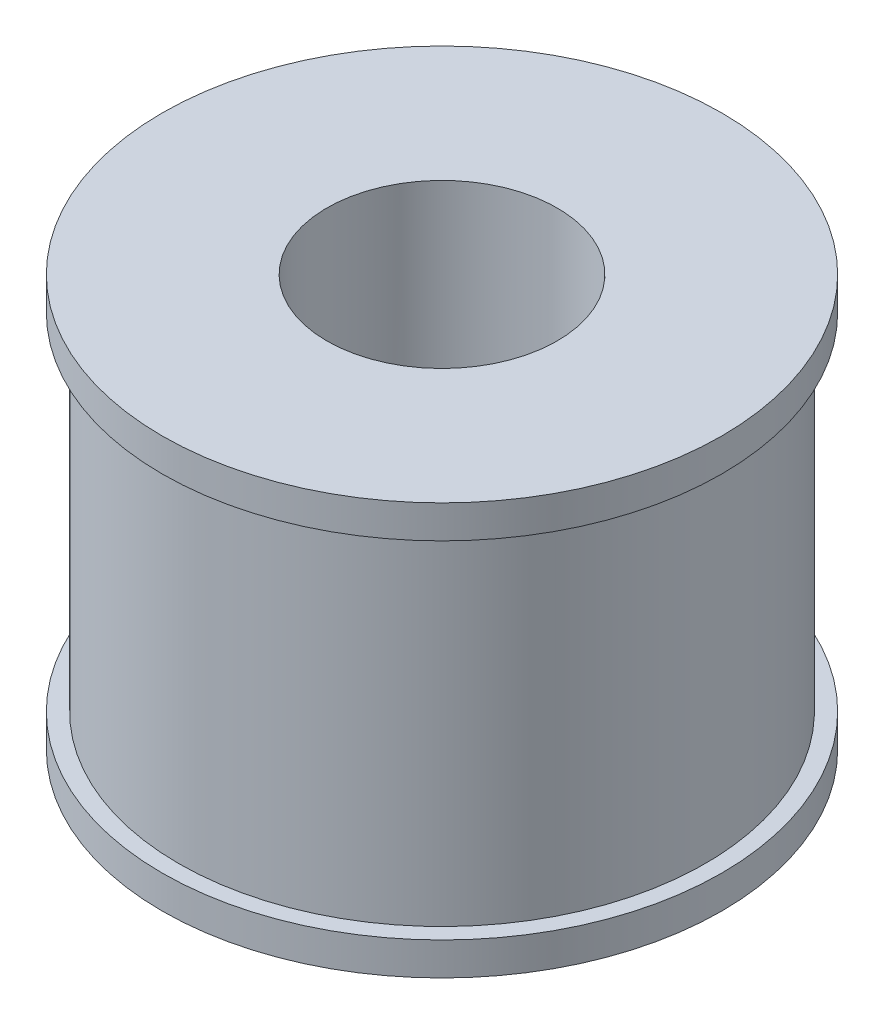
ISO-10303-21;
HEADER;
FILE_DESCRIPTION(('STEP AP214'),'2;1');
FILE_NAME('part.step','',(''),(''),'','','');
FILE_SCHEMA(('AUTOMOTIVE_DESIGN { 1 0 10303 214 1 1 1 1 }'));
ENDSEC;
DATA;
#1=APPLICATION_CONTEXT('core data for automotive mechanical design processes');
#2=APPLICATION_PROTOCOL_DEFINITION('international standard','automotive_design',2000,#1);
#3=PRODUCT_CONTEXT('',#1,'mechanical');
#4=PRODUCT('Part','Part','',(#3));
#5=PRODUCT_RELATED_PRODUCT_CATEGORY('part','',(#4));
#6=PRODUCT_DEFINITION_FORMATION('','',#4);
#7=PRODUCT_DEFINITION_CONTEXT('part definition',#1,'design');
#8=PRODUCT_DEFINITION('design','',#6,#7);
#9=PRODUCT_DEFINITION_SHAPE('','',#8);
#10=(LENGTH_UNIT() NAMED_UNIT(*) SI_UNIT(.MILLI.,.METRE.));
#11=(NAMED_UNIT(*) PLANE_ANGLE_UNIT() SI_UNIT($,.RADIAN.));
#12=(NAMED_UNIT(*) SI_UNIT($,.STERADIAN.) SOLID_ANGLE_UNIT());
#13=UNCERTAINTY_MEASURE_WITH_UNIT(LENGTH_MEASURE(1.E-05),#10,'distance_accuracy_value','');
#14=(GEOMETRIC_REPRESENTATION_CONTEXT(3) GLOBAL_UNCERTAINTY_ASSIGNED_CONTEXT((#13)) GLOBAL_UNIT_ASSIGNED_CONTEXT((#10,
#11,#12)) REPRESENTATION_CONTEXT('',''));
#15=CARTESIAN_POINT('',(0.,0.,0.));
#16=DIRECTION('',(0.,0.,1.));
#17=DIRECTION('',(1.,0.,0.));
#18=AXIS2_PLACEMENT_3D('',#15,#16,#17);
#19=CARTESIAN_POINT('',(0.,2.,0.));
#20=DIRECTION('',(0.,-1.,0.));
#21=DIRECTION('',(0.,0.,-1.));
#22=AXIS2_PLACEMENT_3D('',#19,#20,#21);
#23=PLANE('',#22);
#24=CARTESIAN_POINT('',(0.,2.,0.));
#25=DIRECTION('',(0.,-1.,0.));
#26=DIRECTION('',(0.,0.,-1.));
#27=AXIS2_PLACEMENT_3D('',#24,#25,#26);
#28=CIRCLE('',#27,16.);
#29=CARTESIAN_POINT('',(0.,2.,-16.));
#30=VERTEX_POINT('',#29);
#31=EDGE_CURVE('E11',#30,#30,#28,.F.);
#32=ORIENTED_EDGE('',*,*,#31,.F.);
#33=EDGE_LOOP('',(#32));
#34=FACE_BOUND('',#33,.T.);
#35=CARTESIAN_POINT('',(0.,2.,0.));
#36=DIRECTION('',(0.,1.,0.));
#37=DIRECTION('',(0.,0.,1.));
#38=AXIS2_PLACEMENT_3D('',#35,#36,#37);
#39=CIRCLE('',#38,17.);
#40=CARTESIAN_POINT('',(0.,2.,17.));
#41=VERTEX_POINT('',#40);
#42=EDGE_CURVE('E157',#41,#41,#39,.T.);
#43=ORIENTED_EDGE('',*,*,#42,.T.);
#44=EDGE_LOOP('',(#43));
#45=FACE_BOUND('',#44,.T.);
#46=ADVANCED_FACE('F37',(#34,#45),#23,.F.);
#47=CARTESIAN_POINT('',(0.,23.,0.));
#48=DIRECTION('',(0.,1.,0.));
#49=DIRECTION('',(0.,0.,1.));
#50=AXIS2_PLACEMENT_3D('',#47,#48,#49);
#51=PLANE('',#50);
#52=CARTESIAN_POINT('',(0.,23.,0.));
#53=DIRECTION('',(0.,1.,0.));
#54=DIRECTION('',(0.,0.,1.));
#55=AXIS2_PLACEMENT_3D('',#52,#53,#54);
#56=CIRCLE('',#55,16.);
#57=CARTESIAN_POINT('',(0.,23.,16.));
#58=VERTEX_POINT('',#57);
#59=EDGE_CURVE('E46',#58,#58,#56,.F.);
#60=ORIENTED_EDGE('',*,*,#59,.F.);
#61=EDGE_LOOP('',(#60));
#62=FACE_BOUND('',#61,.T.);
#63=CARTESIAN_POINT('',(0.,23.,0.));
#64=DIRECTION('',(0.,-1.,0.));
#65=DIRECTION('',(0.,0.,-1.));
#66=AXIS2_PLACEMENT_3D('',#63,#64,#65);
#67=CIRCLE('',#66,17.);
#68=CARTESIAN_POINT('',(0.,23.,-17.));
#69=VERTEX_POINT('',#68);
#70=EDGE_CURVE('E151',#69,#69,#67,.T.);
#71=ORIENTED_EDGE('',*,*,#70,.T.);
#72=EDGE_LOOP('',(#71));
#73=FACE_BOUND('',#72,.T.);
#74=ADVANCED_FACE('F144',(#62,#73),#51,.F.);
#75=CARTESIAN_POINT('',(0.,5.,-16.501));
#76=DIRECTION('',(0.,0.,1.));
#77=DIRECTION('',(1.,0.,0.));
#78=AXIS2_PLACEMENT_3D('',#75,#76,#77);
#79=CYLINDRICAL_SURFACE('',#78,1.625);
#80=CARTESIAN_POINT('',(0.,5.,-7.5));
#81=DIRECTION('',(0.,0.,-1.));
#82=DIRECTION('',(-1.,0.,0.));
#83=AXIS2_PLACEMENT_3D('',#80,#81,#82);
#84=CIRCLE('',#83,1.625);
#85=CARTESIAN_POINT('',(-1.625,5.,-7.5));
#86=VERTEX_POINT('',#85);
#87=EDGE_CURVE('E129',#86,#86,#84,.F.);
#88=ORIENTED_EDGE('',*,*,#87,.T.);
#89=EDGE_LOOP('',(#88));
#90=FACE_BOUND('',#89,.T.);
#91=CARTESIAN_POINT('',(1.625,5.,-15.9172665681014));
#92=CARTESIAN_POINT('',(1.62499606078793,5.0910240593403,-15.9172676510475));
#93=CARTESIAN_POINT('',(1.61732619683328,5.18210811964596,-15.9180557754324));
#94=CARTESIAN_POINT('',(1.58684576724402,5.36175036702601,-15.9211226386814));
#95=CARTESIAN_POINT('',(1.5640185643267,5.45030566690781,-15.9234030154599));
#96=CARTESIAN_POINT('',(1.5038954878935,5.62226292071555,-15.929193477992));
#97=CARTESIAN_POINT('',(1.4666084446112,5.70566798378692,-15.9327028131274));
#98=CARTESIAN_POINT('',(1.37864120392538,5.8650179928389,-15.9405548559947));
#99=CARTESIAN_POINT('',(1.32796364568506,5.94096440481843,-15.9448973994617));
#100=CARTESIAN_POINT('',(1.21444999951955,6.08354367004625,-15.9539447868819));
#101=CARTESIAN_POINT('',(1.15157395936691,6.15014464514957,-15.958650789883));
#102=CARTESIAN_POINT('',(1.0155335814702,6.27186792841075,-15.9678843323712));
#103=CARTESIAN_POINT('',(0.942368771016045,6.32698970887652,-15.9724118636463));
#104=CARTESIAN_POINT('',(0.787632151942316,6.42430032376049,-15.9807898037101));
#105=CARTESIAN_POINT('',(0.706042490217867,6.46646090829568,-15.9846387257468));
#106=CARTESIAN_POINT('',(0.536896093852683,6.53647160447494,-15.9912131577967));
#107=CARTESIAN_POINT('',(0.449339508963147,6.56432207510864,-15.9939386959912));
#108=CARTESIAN_POINT('',(0.271066991967132,6.60482837485337,-15.9979511293628));
#109=CARTESIAN_POINT('',(0.180363077462553,6.61753659564644,-15.9992429839665));
#110=CARTESIAN_POINT('',(-0.00189875307088815,6.62755977964678,-16.0002593634928));
#111=CARTESIAN_POINT('',(-0.0934566462484766,6.62487515357203,-15.9999839302344));
#112=CARTESIAN_POINT('',(-0.274471735654066,6.60423135068846,-15.9979008247753));
#113=CARTESIAN_POINT('',(-0.363935431020959,6.5863285115981,-15.9960988040744));
#114=CARTESIAN_POINT('',(-0.538581699806607,6.53584426206,-15.9911715206921));
#115=CARTESIAN_POINT('',(-0.6237642160999,6.50326265580545,-15.9880462403591));
#116=CARTESIAN_POINT('',(-0.787607511537278,6.42428407724619,-15.9808140755214));
#117=CARTESIAN_POINT('',(-0.866256207110845,6.377862205549,-15.976705424529));
#118=CARTESIAN_POINT('',(-1.01466746174738,6.27253892483887,-15.9679674671444));
#119=CARTESIAN_POINT('',(-1.08442975182622,6.21363713821293,-15.9633381449999));
#120=CARTESIAN_POINT('',(-1.21341793414155,6.08470926256256,-15.9540536059509));
#121=CARTESIAN_POINT('',(-1.27259484492326,6.01463415989806,-15.9493983664835));
#122=CARTESIAN_POINT('',(-1.37835315834778,5.86551867536658,-15.9406075082658));
#123=CARTESIAN_POINT('',(-1.42493454176331,5.78647827981421,-15.9364718903087));
#124=CARTESIAN_POINT('',(-1.50417945927507,5.62163789762751,-15.9291881714658));
#125=CARTESIAN_POINT('',(-1.53683991715189,5.53583642190079,-15.9260402888884));
#126=CARTESIAN_POINT('',(-1.58727684911276,5.35992829652819,-15.921092932866));
#127=CARTESIAN_POINT('',(-1.60505379124498,5.26982178235886,-15.9192934170187));
#128=CARTESIAN_POINT('',(-1.62515595811183,5.08829152393263,-15.9172538982886));
#129=CARTESIAN_POINT('',(-1.62754973066459,4.99687544504994,-15.9170069771084));
#130=CARTESIAN_POINT('',(-1.61699767660353,4.81494346664697,-15.9180823448585));
#131=CARTESIAN_POINT('',(-1.60405206390762,4.72442755459102,-15.9194046119055));
#132=CARTESIAN_POINT('',(-1.56324608904987,4.54706544643436,-15.9234630735524));
#133=CARTESIAN_POINT('',(-1.53541818271954,4.46021170674371,-15.926196190871));
#134=CARTESIAN_POINT('',(-1.46567070273802,4.29240483112173,-15.9327659000671));
#135=CARTESIAN_POINT('',(-1.42375079645537,4.21145183452805,-15.9366025179915));
#136=CARTESIAN_POINT('',(-1.32683772903147,4.05743209040902,-15.9449636720481));
#137=CARTESIAN_POINT('',(-1.27179917061536,3.98439403857098,-15.9494905768819));
#138=CARTESIAN_POINT('',(-1.15027615950833,3.84856856091503,-15.9587144979968));
#139=CARTESIAN_POINT('',(-1.08379141444292,3.78578139701945,-15.9634115186209));
#140=CARTESIAN_POINT('',(-0.94096579590208,3.67200335816707,-15.9724673363053));
#141=CARTESIAN_POINT('',(-0.864589189243281,3.6210572191203,-15.9768248106361));
#142=CARTESIAN_POINT('',(-0.704324245717182,3.53271534203882,-15.9846912772566));
#143=CARTESIAN_POINT('',(-0.620436014608218,3.49531941326419,-15.9882002814897));
#144=CARTESIAN_POINT('',(-0.447684839878385,3.43521518223265,-15.9939684674969));
#145=CARTESIAN_POINT('',(-0.358831354012277,3.41247992552822,-15.9962299418098));
#146=CARTESIAN_POINT('',(-0.178544036244694,3.38225445521685,-15.9992576727053));
#147=CARTESIAN_POINT('',(-0.0871102793865123,3.37476379870602,-16.0000239727274));
#148=CARTESIAN_POINT('',(0.0953028453720753,3.37524650162272,-15.9999749810733));
#149=CARTESIAN_POINT('',(0.186282406842767,3.38315043943933,-15.999166789531));
#150=CARTESIAN_POINT('',(0.365614133819023,3.41405231308992,-15.9960736410199));
#151=CARTESIAN_POINT('',(0.453966297442373,3.43705025973667,-15.9937886829933));
#152=CARTESIAN_POINT('',(0.625534210140409,3.49746794221035,-15.9879979877415));
#153=CARTESIAN_POINT('',(0.708750707030929,3.53488557257953,-15.9844924287469));
#154=CARTESIAN_POINT('',(0.86773305269915,3.62307309146041,-15.9766511515298));
#155=CARTESIAN_POINT('',(0.943498937515086,3.67384291538386,-15.9723154373231));
#156=CARTESIAN_POINT('',(1.08578506651673,3.78755380963585,-15.9632760963413));
#157=CARTESIAN_POINT('',(1.15226390085327,3.85054657709161,-15.9585709592728));
#158=CARTESIAN_POINT('',(1.2737381079708,3.98681284872344,-15.9493358078429));
#159=CARTESIAN_POINT('',(1.32873072347144,4.06008881435167,-15.9448058357422));
#160=CARTESIAN_POINT('',(1.42578561431275,4.21505182380254,-15.9364212391675));
#161=CARTESIAN_POINT('',(1.46781371105772,4.29676035526403,-15.93256841116));
#162=CARTESIAN_POINT('',(1.53749692271342,4.46606220178281,-15.9259957127517));
#163=CARTESIAN_POINT('',(1.56516821714008,4.55364876622409,-15.9232745676811));
#164=CARTESIAN_POINT('',(1.59846730348592,4.70144081145875,-15.9199581471362));
#165=CARTESIAN_POINT('',(1.60840342749754,4.76070208040587,-15.918953592283));
#166=CARTESIAN_POINT('',(1.62167106027529,4.87996686967012,-15.9176074471159));
#167=CARTESIAN_POINT('',(1.62500259787774,4.93997038674535,-15.9172658539075));
#168=CARTESIAN_POINT('',(1.625,5.,-15.9172665681014));
#169=B_SPLINE_CURVE_WITH_KNOTS('',3,(#91,#92,#93,#94,#95,#96,#97,#98,#99,#100,#101,#102,#103,
#104,#105,#106,#107,#108,#109,#110,#111,#112,#113,#114,#115,#116,#117,#118,#119,#120,#121,#122,
#123,#124,#125,#126,#127,#128,#129,#130,#131,#132,#133,#134,#135,#136,#137,#138,#139,#140,#141,
#142,#143,#144,#145,#146,#147,#148,#149,#150,#151,#152,#153,#154,#155,#156,#157,#158,#159,#160,
#161,#162,#163,#164,#165,#166,#167,#168),.UNSPECIFIED.,.T.,.F.,(4,2,2,2,2,2,2,2,2,2,2,2,2,2,2,2,
2,2,2,2,2,2,2,2,2,2,2,2,2,2,2,2,2,2,2,2,2,2,4),(0.,0.272852956061154,0.546005902280196,
0.818992303389229,1.09192494114653,1.36576705141177,1.63962174726702,1.91406916569291,
2.18850969887747,2.46199789376216,2.73547879136132,3.00795165179119,3.28042814696918,
3.55339783097986,3.82637577559391,4.1005859100087,4.37479646300728,4.64906757915218,
4.92333006985417,5.19636958710352,5.46940529668031,5.74184797408863,6.01429708276089,
6.28770305508802,6.56111601216877,6.83554572748433,7.10997157963178,7.38389143534204,
7.65780333269974,7.93048288937264,8.20316264138286,8.47580259374747,8.74844122730147,
9.02225916627795,9.29614276022058,9.57074234642815,9.84503179449827,10.0249768448564,
10.2049211095536),.UNSPECIFIED.);
#170=CARTESIAN_POINT('',(1.625,5.,-15.9172665681014));
#171=VERTEX_POINT('',#170);
#172=EDGE_CURVE('E230',#171,#171,#169,.T.);
#173=ORIENTED_EDGE('',*,*,#172,.F.);
#174=EDGE_LOOP('',(#173));
#175=FACE_BOUND('',#174,.T.);
#176=ADVANCED_FACE('F147',(#90,#175),#79,.F.);
#177=CARTESIAN_POINT('',(0.,25.,0.));
#178=DIRECTION('',(0.,1.,0.));
#179=DIRECTION('',(0.,0.,1.));
#180=AXIS2_PLACEMENT_3D('',#177,#178,#179);
#181=PLANE('',#180);
#182=CARTESIAN_POINT('',(0.,25.,0.));
#183=DIRECTION('',(0.,-1.,0.));
#184=DIRECTION('',(0.,0.,-1.));
#185=AXIS2_PLACEMENT_3D('',#182,#183,#184);
#186=CIRCLE('',#185,17.);
#187=CARTESIAN_POINT('',(0.,25.,-17.));
#188=VERTEX_POINT('',#187);
#189=EDGE_CURVE('E153',#188,#188,#186,.T.);
#190=ORIENTED_EDGE('',*,*,#189,.F.);
#191=EDGE_LOOP('',(#190));
#192=FACE_BOUND('',#191,.T.);
#193=CARTESIAN_POINT('',(0.,25.,0.));
#194=DIRECTION('',(0.,1.,0.));
#195=DIRECTION('',(0.,0.,1.));
#196=AXIS2_PLACEMENT_3D('',#193,#194,#195);
#197=CIRCLE('',#196,7.);
#198=CARTESIAN_POINT('',(0.,25.,7.));
#199=VERTEX_POINT('',#198);
#200=EDGE_CURVE('E133',#199,#199,#197,.T.);
#201=ORIENTED_EDGE('',*,*,#200,.F.);
#202=EDGE_LOOP('',(#201));
#203=FACE_BOUND('',#202,.T.);
#204=ADVANCED_FACE('F179',(#192,#203),#181,.T.);
#205=CARTESIAN_POINT('',(0.,0.,0.));
#206=DIRECTION('',(0.,1.,0.));
#207=DIRECTION('',(0.,0.,1.));
#208=AXIS2_PLACEMENT_3D('',#205,#206,#207);
#209=PLANE('',#208);
#210=CARTESIAN_POINT('',(0.,0.,0.));
#211=DIRECTION('',(0.,-1.,0.));
#212=DIRECTION('',(0.,0.,-1.));
#213=AXIS2_PLACEMENT_3D('',#210,#211,#212);
#214=CIRCLE('',#213,3.1);
#215=CARTESIAN_POINT('',(0.,0.,-3.1));
#216=VERTEX_POINT('',#215);
#217=EDGE_CURVE('E208',#216,#216,#214,.T.);
#218=ORIENTED_EDGE('',*,*,#217,.F.);
#219=EDGE_LOOP('',(#218));
#220=FACE_BOUND('',#219,.T.);
#221=CARTESIAN_POINT('',(0.,0.,0.));
#222=DIRECTION('',(0.,1.,0.));
#223=DIRECTION('',(0.,0.,1.));
#224=AXIS2_PLACEMENT_3D('',#221,#222,#223);
#225=CIRCLE('',#224,17.);
#226=CARTESIAN_POINT('',(0.,0.,17.));
#227=VERTEX_POINT('',#226);
#228=EDGE_CURVE('E117',#227,#227,#225,.T.);
#229=ORIENTED_EDGE('',*,*,#228,.F.);
#230=EDGE_LOOP('',(#229));
#231=FACE_BOUND('',#230,.T.);
#232=DIRECTION('',(-1.,0.,0.));
#233=VECTOR('',#232,1.);
#234=CARTESIAN_POINT('',(0.,0.,-4.5));
#235=LINE('',#234,#233);
#236=CARTESIAN_POINT('',(3.17,0.,-4.5));
#237=VERTEX_POINT('',#236);
#238=CARTESIAN_POINT('',(-3.17,0.,-4.5));
#239=VERTEX_POINT('',#238);
#240=EDGE_CURVE('E114',#237,#239,#235,.T.);
#241=ORIENTED_EDGE('',*,*,#240,.F.);
#242=DIRECTION('',(0.,0.,1.));
#243=VECTOR('',#242,1.);
#244=CARTESIAN_POINT('',(3.17,0.,-7.5));
#245=LINE('',#244,#243);
#246=CARTESIAN_POINT('',(3.17,0.,-7.5));
#247=VERTEX_POINT('',#246);
#248=EDGE_CURVE('E53',#247,#237,#245,.T.);
#249=ORIENTED_EDGE('',*,*,#248,.F.);
#250=DIRECTION('',(1.,0.,0.));
#251=VECTOR('',#250,1.);
#252=CARTESIAN_POINT('',(-3.17,0.,-7.5));
#253=LINE('',#252,#251);
#254=CARTESIAN_POINT('',(-3.17,0.,-7.5));
#255=VERTEX_POINT('',#254);
#256=EDGE_CURVE('E119',#255,#247,#253,.T.);
#257=ORIENTED_EDGE('',*,*,#256,.F.);
#258=DIRECTION('',(0.,0.,-1.));
#259=VECTOR('',#258,1.);
#260=CARTESIAN_POINT('',(-3.17,0.,-4.5));
#261=LINE('',#260,#259);
#262=EDGE_CURVE('E100',#239,#255,#261,.T.);
#263=ORIENTED_EDGE('',*,*,#262,.F.);
#264=EDGE_LOOP('',(#241,#249,#257,#263));
#265=FACE_BOUND('',#264,.T.);
#266=ADVANCED_FACE('F39',(#220,#231,#265),#209,.F.);
#267=CARTESIAN_POINT('',(1.625,5.,-2.63995738601971));
#268=CARTESIAN_POINT('',(1.62499369358639,5.08402011840656,-2.63996569197711));
#269=CARTESIAN_POINT('',(1.61843926848346,5.16813134161948,-2.6440306646884));
#270=CARTESIAN_POINT('',(1.59258026030076,5.33371892131321,-2.65968063273482));
#271=CARTESIAN_POINT('',(1.57325150158178,5.41518997394179,-2.67127988610549));
#272=CARTESIAN_POINT('',(1.5229416019621,5.57278191734646,-2.70027374321845));
#273=CARTESIAN_POINT('',(1.49202732847947,5.64893059031451,-2.71763502604676));
#274=CARTESIAN_POINT('',(1.41962906763283,5.79493818250812,-2.75614401860979));
#275=CARTESIAN_POINT('',(1.37814366245454,5.86479625632785,-2.77729223614005));
#276=CARTESIAN_POINT('',(1.28135217783335,6.00326047831771,-2.82334190963701));
#277=CARTESIAN_POINT('',(1.2251308753348,6.07117179097527,-2.84840976473617));
#278=CARTESIAN_POINT('',(1.1023605526905,6.19714998002737,-2.89813560243633));
#279=CARTESIAN_POINT('',(1.03580595908106,6.25521150817134,-2.92279335584776));
#280=CARTESIAN_POINT('',(0.888094358984732,6.36416848437918,-2.97115595461785));
#281=CARTESIAN_POINT('',(0.806212382161948,6.41418534814089,-2.99464636761452));
#282=CARTESIAN_POINT('',(0.633732733383832,6.49941347272161,-3.03582277624352));
#283=CARTESIAN_POINT('',(0.543141151865711,6.5346349883903,-3.05351279033609));
#284=CARTESIAN_POINT('',(0.363195332507896,6.58644020349888,-3.07988813626475));
#285=CARTESIAN_POINT('',(0.274282091522951,6.60424930744631,-3.08916152676322));
#286=CARTESIAN_POINT('',(0.0942858955441184,6.62478424111477,-3.09987375068868));
#287=CARTESIAN_POINT('',(0.00320444788753966,6.62752025885552,-3.10131787596824));
#288=CARTESIAN_POINT('',(-0.169226436953113,6.61824761682093,-3.09646459293852));
#289=CARTESIAN_POINT('',(-0.250675696619699,6.60762007394134,-3.0908922559455));
#290=CARTESIAN_POINT('',(-0.410437049802163,6.57442799872566,-3.07375939172626));
#291=CARTESIAN_POINT('',(-0.488748905643017,6.55186256386326,-3.06219841174913));
#292=CARTESIAN_POINT('',(-0.641286454469586,6.49535276203171,-3.03394965052952));
#293=CARTESIAN_POINT('',(-0.715448366106232,6.46126884766187,-3.01719921644795));
#294=CARTESIAN_POINT('',(-0.857164912791588,6.38291600562167,-2.98004077213943));
#295=CARTESIAN_POINT('',(-0.924717270339831,6.33864358471748,-2.95963150797671));
#296=CARTESIAN_POINT('',(-1.05859628134866,6.23604734259653,-2.91459297851262));
#297=CARTESIAN_POINT('',(-1.12410789232571,6.1767552175741,-2.88974567439597));
#298=CARTESIAN_POINT('',(-1.24471946946172,6.04836431736453,-2.83988406527652));
#299=CARTESIAN_POINT('',(-1.29981005622849,5.97925680489467,-2.81486963061241));
#300=CARTESIAN_POINT('',(-1.40208881995267,5.82692302196492,-2.76543137638124));
#301=CARTESIAN_POINT('',(-1.44837848646489,5.74302752082937,-2.74119147050608));
#302=CARTESIAN_POINT('',(-1.52585070400779,5.56711017175289,-2.6988416802505));
#303=CARTESIAN_POINT('',(-1.55705009111533,5.47509751624713,-2.68072497111122));
#304=CARTESIAN_POINT('',(-1.60081241171286,5.29332130295122,-2.65480754447564));
#305=CARTESIAN_POINT('',(-1.61467922848063,5.20397835970499,-2.64629062268326));
#306=CARTESIAN_POINT('',(-1.62732459238139,5.02386205794669,-2.63853777607081));
#307=CARTESIAN_POINT('',(-1.62611652898328,4.93309004030733,-2.63929361519884));
#308=CARTESIAN_POINT('',(-1.60984275618565,4.76493085697804,-2.64923876494547));
#309=CARTESIAN_POINT('',(-1.59654159310065,4.68729783013928,-2.65735388246111));
#310=CARTESIAN_POINT('',(-1.5591717923286,4.5355451516447,-2.67944975176477));
#311=CARTESIAN_POINT('',(-1.53509916674596,4.46142681247462,-2.69343267585902));
#312=CARTESIAN_POINT('',(-1.47576398643234,4.31496554086245,-2.72641092538126));
#313=CARTESIAN_POINT('',(-1.44004557124197,4.24285358554413,-2.74560393467464));
#314=CARTESIAN_POINT('',(-1.35881804841414,4.10521952579725,-2.78669779590758));
#315=CARTESIAN_POINT('',(-1.31330391835398,4.0397008272235,-2.80860003445415));
#316=CARTESIAN_POINT('',(-1.20628480346784,3.90742364010256,-2.85635634305187));
#317=CARTESIAN_POINT('',(-1.14342934079155,3.84179639251155,-2.88233173401643));
#318=CARTESIAN_POINT('',(-1.00728117427384,3.72161905489838,-2.93268712127722));
#319=CARTESIAN_POINT('',(-0.933983800437785,3.66707394782967,-2.95706639657449));
#320=CARTESIAN_POINT('',(-0.775446273445874,3.56880599193446,-3.00261959020605));
#321=CARTESIAN_POINT('',(-0.689864375096574,3.52555870974024,-3.02364137636473));
#322=CARTESIAN_POINT('',(-0.51122177332194,3.45452537990951,-3.05890678382001));
#323=CARTESIAN_POINT('',(-0.418168346171317,3.426724493633,-3.07315690842782));
#324=CARTESIAN_POINT('',(-0.236965457939999,3.38997725980696,-3.09213987002578));
#325=CARTESIAN_POINT('',(-0.149216633307814,3.37946280092398,-3.0976622056168));
#326=CARTESIAN_POINT('',(0.0269588914443473,3.37283754354231,-3.10113227843175));
#327=CARTESIAN_POINT('',(0.11538528615591,3.37672059743097,-3.09908324856411));
#328=CARTESIAN_POINT('',(0.283219694811608,3.3978092080424,-3.08809352832672));
#329=CARTESIAN_POINT('',(0.362798824635575,3.41396888962501,-3.07969410154116));
#330=CARTESIAN_POINT('',(0.517955172786841,3.45764935668563,-3.05742838356155));
#331=CARTESIAN_POINT('',(0.593531865779954,3.48517162939514,-3.04356137673531));
#332=CARTESIAN_POINT('',(0.74191277498795,3.55187414423842,-3.01090776140316));
#333=CARTESIAN_POINT('',(0.814490807361442,3.59147057909153,-2.99194901124051));
#334=CARTESIAN_POINT('',(0.952248083460892,3.6806852724956,-2.95099922179534));
#335=CARTESIAN_POINT('',(1.01742403461112,3.73030796383891,-2.92900684265908));
#336=CARTESIAN_POINT('',(1.14594183471771,3.8443209118488,-2.88131987486187));
#337=CARTESIAN_POINT('',(1.20833253836179,3.90972543365618,-2.8554814992914));
#338=CARTESIAN_POINT('',(1.32166541281029,4.05027202334204,-2.80482859684973));
#339=CARTESIAN_POINT('',(1.37259565608734,4.12542410902335,-2.78001515840719));
#340=CARTESIAN_POINT('',(1.46375646526482,4.28787322455436,-2.73316111003119));
#341=CARTESIAN_POINT('',(1.50336480023787,4.37557728224365,-2.71130789266397));
#342=CARTESIAN_POINT('',(1.56665179853564,4.55788698365071,-2.6752492515408));
#343=CARTESIAN_POINT('',(1.59038304584357,4.65246868334933,-2.66101861378825));
#344=CARTESIAN_POINT('',(1.61194761392507,4.79018946005844,-2.64795592099182));
#345=CARTESIAN_POINT('',(1.61683277533652,4.83193618038413,-2.6449699904358));
#346=CARTESIAN_POINT('',(1.62336063808953,4.91578095549929,-2.64096858692304));
#347=CARTESIAN_POINT('',(1.62500316153163,4.9578790294377,-2.63995322207666));
#348=CARTESIAN_POINT('',(1.625,5.,-2.63995738601971));
#349=B_SPLINE_CURVE_WITH_KNOTS('',3,(#267,#268,#269,#270,#271,#272,#273,#274,#275,#276,#277,
#278,#279,#280,#281,#282,#283,#284,#285,#286,#287,#288,#289,#290,#291,#292,#293,#294,#295,#296,
#297,#298,#299,#300,#301,#302,#303,#304,#305,#306,#307,#308,#309,#310,#311,#312,#313,#314,#315,
#316,#317,#318,#319,#320,#321,#322,#323,#324,#325,#326,#327,#328,#329,#330,#331,#332,#333,#334,
#335,#336,#337,#338,#339,#340,#341,#342,#343,#344,#345,#346,#347,#348),.UNSPECIFIED.,.T.,.F.,(4,
2,2,2,2,2,2,2,2,2,2,2,2,2,2,2,2,2,2,2,2,2,2,2,2,2,2,2,2,2,2,2,2,2,2,2,2,2,2,2,4),(0.,
0.251882549586685,0.504243161386659,0.755169125749292,1.0061287623666,1.27996909428787,
1.55395764379918,1.84874530853398,2.14332831358926,2.41524801944688,2.68698391002695,
2.9328081263225,3.17865093003143,3.42758578948175,3.67660612629282,3.95081340792788,
4.22526632628097,4.52023431483547,4.81487244699452,5.08566593545422,5.3562189229825,
5.592695536212,5.8292597722065,6.07649721605832,6.32386172584941,6.60615445088863,
6.88857382597078,7.18145166593953,7.47404766305176,7.73824446561781,8.00232847144208,
8.24613454929827,8.48997254866696,8.74340731322427,8.99695437210027,9.27777037288049,
9.55887729621583,9.85332023949389,10.1467831127377,10.2730499597624,10.3993237339192),.UNSPECIFIED.);
#350=CARTESIAN_POINT('',(1.625,5.,-2.63995738601971));
#351=VERTEX_POINT('',#350);
#352=EDGE_CURVE('E154',#351,#351,#349,.T.);
#353=ORIENTED_EDGE('',*,*,#352,.T.);
#354=EDGE_LOOP('',(#353));
#355=FACE_BOUND('',#354,.T.);
#356=CARTESIAN_POINT('',(0.,5.,-4.5));
#357=DIRECTION('',(0.,0.,1.));
#358=DIRECTION('',(1.,0.,0.));
#359=AXIS2_PLACEMENT_3D('',#356,#357,#358);
#360=CIRCLE('',#359,1.625);
#361=CARTESIAN_POINT('',(1.625,5.,-4.5));
#362=VERTEX_POINT('',#361);
#363=EDGE_CURVE('E124',#362,#362,#360,.F.);
#364=ORIENTED_EDGE('',*,*,#363,.T.);
#365=EDGE_LOOP('',(#364));
#366=FACE_BOUND('',#365,.T.);
#367=ADVANCED_FACE('F178',(#355,#366),#79,.F.);
#368=CARTESIAN_POINT('',(0.,9.,0.));
#369=DIRECTION('',(0.,1.,0.));
#370=DIRECTION('',(0.,0.,1.));
#371=AXIS2_PLACEMENT_3D('',#368,#369,#370);
#372=CYLINDRICAL_SURFACE('',#371,7.);
#373=CARTESIAN_POINT('',(0.,9.,0.));
#374=DIRECTION('',(0.,1.,0.));
#375=DIRECTION('',(0.,0.,1.));
#376=AXIS2_PLACEMENT_3D('',#373,#374,#375);
#377=CIRCLE('',#376,7.);
#378=CARTESIAN_POINT('',(3.17,9.,-6.24108163702415));
#379=VERTEX_POINT('',#378);
#380=CARTESIAN_POINT('',(-3.17,9.,-6.24108163702415));
#381=VERTEX_POINT('',#380);
#382=EDGE_CURVE('E93',#379,#381,#377,.T.);
#383=ORIENTED_EDGE('',*,*,#382,.F.);
#384=EDGE_CURVE('E132',#381,#379,#377,.T.);
#385=ORIENTED_EDGE('',*,*,#384,.F.);
#386=EDGE_LOOP('',(#383,#385));
#387=FACE_BOUND('',#386,.T.);
#388=ORIENTED_EDGE('',*,*,#200,.T.);
#389=EDGE_LOOP('',(#388));
#390=FACE_BOUND('',#389,.T.);
#391=ADVANCED_FACE('F186',(#387,#390),#372,.F.);
#392=CARTESIAN_POINT('',(0.,9.,0.));
#393=DIRECTION('',(0.,1.,0.));
#394=DIRECTION('',(0.,0.,1.));
#395=AXIS2_PLACEMENT_3D('',#392,#393,#394);
#396=PLANE('',#395);
#397=CARTESIAN_POINT('',(0.,9.,0.));
#398=DIRECTION('',(0.,1.,0.));
#399=DIRECTION('',(0.,0.,1.));
#400=AXIS2_PLACEMENT_3D('',#397,#398,#399);
#401=CIRCLE('',#400,3.1);
#402=CARTESIAN_POINT('',(0.,9.,3.1));
#403=VERTEX_POINT('',#402);
#404=EDGE_CURVE('E41',#403,#403,#401,.T.);
#405=ORIENTED_EDGE('',*,*,#404,.F.);
#406=EDGE_LOOP('',(#405));
#407=FACE_BOUND('',#406,.T.);
#408=DIRECTION('',(0.,0.,-1.));
#409=VECTOR('',#408,1.);
#410=CARTESIAN_POINT('',(3.17,9.,0.));
#411=LINE('',#410,#409);
#412=CARTESIAN_POINT('',(3.17,9.,-4.5));
#413=VERTEX_POINT('',#412);
#414=EDGE_CURVE('E131',#413,#379,#411,.T.);
#415=ORIENTED_EDGE('',*,*,#414,.F.);
#416=DIRECTION('',(-1.,0.,0.));
#417=VECTOR('',#416,1.);
#418=CARTESIAN_POINT('',(3.17,9.,-4.5));
#419=LINE('',#418,#417);
#420=CARTESIAN_POINT('',(-3.17,9.,-4.5));
#421=VERTEX_POINT('',#420);
#422=EDGE_CURVE('E94',#413,#421,#419,.T.);
#423=ORIENTED_EDGE('',*,*,#422,.T.);
#424=DIRECTION('',(0.,0.,-1.));
#425=VECTOR('',#424,1.);
#426=CARTESIAN_POINT('',(-3.17,9.,-4.5));
#427=LINE('',#426,#425);
#428=EDGE_CURVE('E61',#421,#381,#427,.T.);
#429=ORIENTED_EDGE('',*,*,#428,.T.);
#430=ORIENTED_EDGE('',*,*,#384,.T.);
#431=EDGE_LOOP('',(#415,#423,#429,#430));
#432=FACE_BOUND('',#431,.T.);
#433=ADVANCED_FACE('F169',(#407,#432),#396,.T.);
#434=CARTESIAN_POINT('',(-3.17,9.,-7.5));
#435=DIRECTION('',(0.,0.,-1.));
#436=DIRECTION('',(-1.,0.,0.));
#437=AXIS2_PLACEMENT_3D('',#434,#435,#436);
#438=PLANE('',#437);
#439=ORIENTED_EDGE('',*,*,#256,.T.);
#440=DIRECTION('',(0.,-1.,0.));
#441=VECTOR('',#440,1.);
#442=CARTESIAN_POINT('',(3.17,9.,-7.5));
#443=LINE('',#442,#441);
#444=CARTESIAN_POINT('',(3.17,9.,-7.5));
#445=VERTEX_POINT('',#444);
#446=EDGE_CURVE('E104',#445,#247,#443,.T.);
#447=ORIENTED_EDGE('',*,*,#446,.F.);
#448=DIRECTION('',(1.,0.,0.));
#449=VECTOR('',#448,1.);
#450=CARTESIAN_POINT('',(-3.17,9.,-7.5));
#451=LINE('',#450,#449);
#452=CARTESIAN_POINT('',(-3.17,9.,-7.5));
#453=VERTEX_POINT('',#452);
#454=EDGE_CURVE('E90',#453,#445,#451,.T.);
#455=ORIENTED_EDGE('',*,*,#454,.F.);
#456=DIRECTION('',(0.,-1.,0.));
#457=VECTOR('',#456,1.);
#458=CARTESIAN_POINT('',(-3.17,9.,-7.5));
#459=LINE('',#458,#457);
#460=EDGE_CURVE('E97',#453,#255,#459,.T.);
#461=ORIENTED_EDGE('',*,*,#460,.T.);
#462=EDGE_LOOP('',(#439,#447,#455,#461));
#463=FACE_BOUND('',#462,.T.);
#464=ORIENTED_EDGE('',*,*,#87,.F.);
#465=EDGE_LOOP('',(#464));
#466=FACE_BOUND('',#465,.T.);
#467=ADVANCED_FACE('F107',(#463,#466),#438,.F.);
#468=CARTESIAN_POINT('',(0.,9.,0.));
#469=DIRECTION('',(0.,-1.,0.));
#470=DIRECTION('',(0.,0.,-1.));
#471=AXIS2_PLACEMENT_3D('',#468,#469,#470);
#472=PLANE('',#471);
#473=ORIENTED_EDGE('',*,*,#382,.T.);
#474=EDGE_CURVE('E85',#381,#453,#427,.T.);
#475=ORIENTED_EDGE('',*,*,#474,.T.);
#476=ORIENTED_EDGE('',*,*,#454,.T.);
#477=DIRECTION('',(0.,0.,1.));
#478=VECTOR('',#477,1.);
#479=CARTESIAN_POINT('',(3.17,9.,-7.5));
#480=LINE('',#479,#478);
#481=EDGE_CURVE('E109',#445,#379,#480,.T.);
#482=ORIENTED_EDGE('',*,*,#481,.T.);
#483=EDGE_LOOP('',(#473,#475,#476,#482));
#484=FACE_BOUND('',#483,.T.);
#485=ADVANCED_FACE('F87',(#484),#472,.T.);
#486=CARTESIAN_POINT('',(0.,9.,-4.5));
#487=DIRECTION('',(0.,0.,1.));
#488=DIRECTION('',(1.,0.,0.));
#489=AXIS2_PLACEMENT_3D('',#486,#487,#488);
#490=PLANE('',#489);
#491=ORIENTED_EDGE('',*,*,#240,.T.);
#492=DIRECTION('',(0.,-1.,0.));
#493=VECTOR('',#492,1.);
#494=CARTESIAN_POINT('',(-3.17,9.,-4.5));
#495=LINE('',#494,#493);
#496=EDGE_CURVE('E105',#421,#239,#495,.T.);
#497=ORIENTED_EDGE('',*,*,#496,.F.);
#498=ORIENTED_EDGE('',*,*,#422,.F.);
#499=DIRECTION('',(0.,-1.,0.));
#500=VECTOR('',#499,1.);
#501=CARTESIAN_POINT('',(3.17,9.,-4.5));
#502=LINE('',#501,#500);
#503=EDGE_CURVE('E122',#413,#237,#502,.T.);
#504=ORIENTED_EDGE('',*,*,#503,.T.);
#505=EDGE_LOOP('',(#491,#497,#498,#504));
#506=FACE_BOUND('',#505,.T.);
#507=ORIENTED_EDGE('',*,*,#363,.F.);
#508=EDGE_LOOP('',(#507));
#509=FACE_BOUND('',#508,.T.);
#510=ADVANCED_FACE('F173',(#506,#509),#490,.F.);
#511=CARTESIAN_POINT('',(3.17,9.,-7.5));
#512=DIRECTION('',(1.,0.,0.));
#513=DIRECTION('',(0.,0.,-1.));
#514=AXIS2_PLACEMENT_3D('',#511,#512,#513);
#515=PLANE('',#514);
#516=ORIENTED_EDGE('',*,*,#248,.T.);
#517=ORIENTED_EDGE('',*,*,#503,.F.);
#518=ORIENTED_EDGE('',*,*,#414,.T.);
#519=ORIENTED_EDGE('',*,*,#481,.F.);
#520=ORIENTED_EDGE('',*,*,#446,.T.);
#521=EDGE_LOOP('',(#516,#517,#518,#519,#520));
#522=FACE_BOUND('',#521,.T.);
#523=ADVANCED_FACE('F251',(#522),#515,.F.);
#524=CARTESIAN_POINT('',(-3.17,9.,-4.5));
#525=DIRECTION('',(-1.,0.,0.));
#526=DIRECTION('',(0.,0.,1.));
#527=AXIS2_PLACEMENT_3D('',#524,#525,#526);
#528=PLANE('',#527);
#529=ORIENTED_EDGE('',*,*,#262,.T.);
#530=ORIENTED_EDGE('',*,*,#460,.F.);
#531=ORIENTED_EDGE('',*,*,#474,.F.);
#532=ORIENTED_EDGE('',*,*,#428,.F.);
#533=ORIENTED_EDGE('',*,*,#496,.T.);
#534=EDGE_LOOP('',(#529,#530,#531,#532,#533));
#535=FACE_BOUND('',#534,.T.);
#536=ADVANCED_FACE('F98',(#535),#528,.F.);
#537=CARTESIAN_POINT('',(0.,2.,0.));
#538=DIRECTION('',(0.,1.,0.));
#539=DIRECTION('',(0.,0.,1.));
#540=AXIS2_PLACEMENT_3D('',#537,#538,#539);
#541=CYLINDRICAL_SURFACE('',#540,16.);
#542=ORIENTED_EDGE('',*,*,#172,.T.);
#543=EDGE_LOOP('',(#542));
#544=FACE_BOUND('',#543,.T.);
#545=ORIENTED_EDGE('',*,*,#31,.T.);
#546=EDGE_LOOP('',(#545));
#547=FACE_BOUND('',#546,.T.);
#548=ORIENTED_EDGE('',*,*,#59,.T.);
#549=EDGE_LOOP('',(#548));
#550=FACE_BOUND('',#549,.T.);
#551=ADVANCED_FACE('F142',(#544,#547,#550),#541,.T.);
#552=CARTESIAN_POINT('',(0.,0.,0.));
#553=DIRECTION('',(0.,1.,0.));
#554=DIRECTION('',(0.,0.,1.));
#555=AXIS2_PLACEMENT_3D('',#552,#553,#554);
#556=CYLINDRICAL_SURFACE('',#555,17.);
#557=ORIENTED_EDGE('',*,*,#228,.T.);
#558=EDGE_LOOP('',(#557));
#559=FACE_BOUND('',#558,.T.);
#560=ORIENTED_EDGE('',*,*,#42,.F.);
#561=EDGE_LOOP('',(#560));
#562=FACE_BOUND('',#561,.T.);
#563=ADVANCED_FACE('F220',(#559,#562),#556,.T.);
#564=CARTESIAN_POINT('',(0.,25.,0.));
#565=DIRECTION('',(0.,-1.,0.));
#566=DIRECTION('',(0.,0.,-1.));
#567=AXIS2_PLACEMENT_3D('',#564,#565,#566);
#568=CYLINDRICAL_SURFACE('',#567,17.);
#569=ORIENTED_EDGE('',*,*,#189,.T.);
#570=EDGE_LOOP('',(#569));
#571=FACE_BOUND('',#570,.T.);
#572=ORIENTED_EDGE('',*,*,#70,.F.);
#573=EDGE_LOOP('',(#572));
#574=FACE_BOUND('',#573,.T.);
#575=ADVANCED_FACE('F215',(#571,#574),#568,.T.);
#576=CARTESIAN_POINT('',(0.,10.,0.));
#577=DIRECTION('',(0.,-1.,0.));
#578=DIRECTION('',(0.,0.,-1.));
#579=AXIS2_PLACEMENT_3D('',#576,#577,#578);
#580=CYLINDRICAL_SURFACE('',#579,3.1);
#581=ORIENTED_EDGE('',*,*,#217,.T.);
#582=EDGE_LOOP('',(#581));
#583=FACE_BOUND('',#582,.T.);
#584=ORIENTED_EDGE('',*,*,#404,.T.);
#585=EDGE_LOOP('',(#584));
#586=FACE_BOUND('',#585,.T.);
#587=ORIENTED_EDGE('',*,*,#352,.F.);
#588=EDGE_LOOP('',(#587));
#589=FACE_BOUND('',#588,.T.);
#590=ADVANCED_FACE('F210',(#583,#586,#589),#580,.F.);
#591=CLOSED_SHELL('',(#46,#74,#176,#204,#266,#367,#391,#433,#467,#485,#510,#523,#536,#551,#563,
#575,#590));
#592=MANIFOLD_SOLID_BREP('B2',#591);
#593=ADVANCED_BREP_SHAPE_REPRESENTATION('',(#18,#592),#14);
#594=SHAPE_DEFINITION_REPRESENTATION(#9,#593);
ENDSEC;
END-ISO-10303-21;
